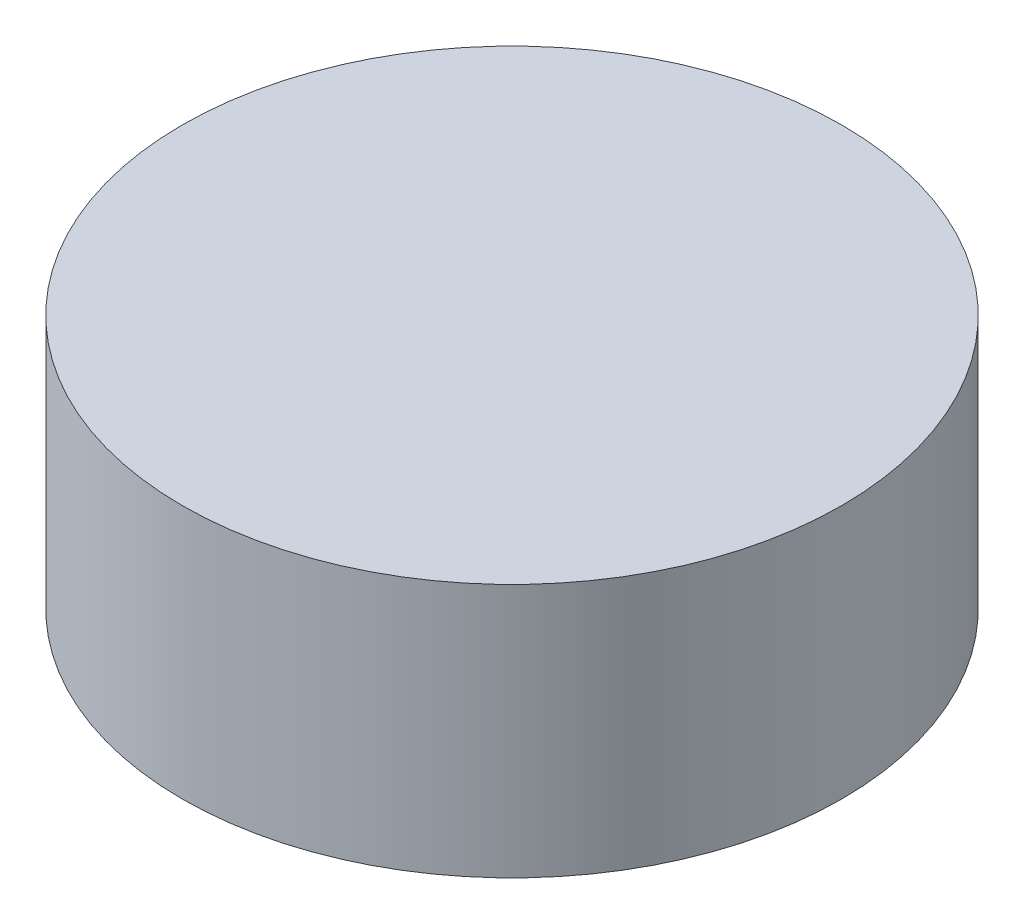
ISO-10303-21;
HEADER;
FILE_DESCRIPTION(('STEP AP214'),'2;1');
FILE_NAME('part.step','',(''),(''),'','','');
FILE_SCHEMA(('AUTOMOTIVE_DESIGN { 1 0 10303 214 1 1 1 1 }'));
ENDSEC;
DATA;
#1=APPLICATION_CONTEXT('core data for automotive mechanical design processes');
#2=APPLICATION_PROTOCOL_DEFINITION('international standard','automotive_design',2000,#1);
#3=PRODUCT_CONTEXT('',#1,'mechanical');
#4=PRODUCT('Part','Part','',(#3));
#5=PRODUCT_RELATED_PRODUCT_CATEGORY('part','',(#4));
#6=PRODUCT_DEFINITION_FORMATION('','',#4);
#7=PRODUCT_DEFINITION_CONTEXT('part definition',#1,'design');
#8=PRODUCT_DEFINITION('design','',#6,#7);
#9=PRODUCT_DEFINITION_SHAPE('','',#8);
#10=(LENGTH_UNIT() NAMED_UNIT(*) SI_UNIT(.MILLI.,.METRE.));
#11=(NAMED_UNIT(*) PLANE_ANGLE_UNIT() SI_UNIT($,.RADIAN.));
#12=(NAMED_UNIT(*) SI_UNIT($,.STERADIAN.) SOLID_ANGLE_UNIT());
#13=UNCERTAINTY_MEASURE_WITH_UNIT(LENGTH_MEASURE(1.E-05),#10,'distance_accuracy_value','');
#14=(GEOMETRIC_REPRESENTATION_CONTEXT(3) GLOBAL_UNCERTAINTY_ASSIGNED_CONTEXT((#13)) GLOBAL_UNIT_ASSIGNED_CONTEXT((#10,
#11,#12)) REPRESENTATION_CONTEXT('',''));
#15=CARTESIAN_POINT('',(0.,0.,0.));
#16=DIRECTION('',(0.,0.,1.));
#17=DIRECTION('',(1.,0.,0.));
#18=AXIS2_PLACEMENT_3D('',#15,#16,#17);
#19=CARTESIAN_POINT('',(0.,4.9911,0.));
#20=DIRECTION('',(0.,-1.,0.));
#21=DIRECTION('',(0.,0.,-1.));
#22=AXIS2_PLACEMENT_3D('',#19,#20,#21);
#23=CYLINDRICAL_SURFACE('',#22,6.475000004);
#24=CARTESIAN_POINT('',(0.,4.9911,0.));
#25=DIRECTION('',(0.,1.,0.));
#26=DIRECTION('',(0.,0.,1.));
#27=AXIS2_PLACEMENT_3D('',#24,#25,#26);
#28=CIRCLE('',#27,6.475000004);
#29=CARTESIAN_POINT('',(0.,4.9911,-6.475000004));
#30=VERTEX_POINT('',#29);
#31=EDGE_CURVE('E10',#30,#30,#28,.T.);
#32=CARTESIAN_POINT('',(0.,0.,0.));
#33=DIRECTION('',(0.,1.,0.));
#34=DIRECTION('',(0.,0.,1.));
#35=AXIS2_PLACEMENT_3D('',#32,#33,#34);
#36=CIRCLE('',#35,6.475000004);
#37=CARTESIAN_POINT('',(0.,0.,-6.475000004));
#38=VERTEX_POINT('',#37);
#39=EDGE_CURVE('E42',#38,#38,#36,.T.);
#40=CARTESIAN_POINT('',(0.,4.9911,-6.475000004));
#41=CARTESIAN_POINT('',(0.,4.939109375,-6.475000004));
#42=CARTESIAN_POINT('',(0.,4.88711875,-6.475000004));
#43=CARTESIAN_POINT('',(0.,4.7831375,-6.475000004));
#44=CARTESIAN_POINT('',(0.,4.731146875,-6.475000004));
#45=CARTESIAN_POINT('',(0.,4.627165625,-6.475000004));
#46=CARTESIAN_POINT('',(0.,4.575175,-6.475000004));
#47=CARTESIAN_POINT('',(0.,4.47119375,-6.475000004));
#48=CARTESIAN_POINT('',(0.,4.419203125,-6.475000004));
#49=CARTESIAN_POINT('',(0.,4.315221875,-6.475000004));
#50=CARTESIAN_POINT('',(0.,4.26323125,-6.475000004));
#51=CARTESIAN_POINT('',(0.,4.15925,-6.475000004));
#52=CARTESIAN_POINT('',(0.,4.107259375,-6.475000004));
#53=CARTESIAN_POINT('',(0.,4.003278125,-6.475000004));
#54=CARTESIAN_POINT('',(0.,3.9512875,-6.475000004));
#55=CARTESIAN_POINT('',(0.,3.84730625,-6.475000004));
#56=CARTESIAN_POINT('',(0.,3.795315625,-6.475000004));
#57=CARTESIAN_POINT('',(0.,3.691334375,-6.475000004));
#58=CARTESIAN_POINT('',(0.,3.63934375,-6.475000004));
#59=CARTESIAN_POINT('',(0.,3.5353625,-6.475000004));
#60=CARTESIAN_POINT('',(0.,3.483371875,-6.475000004));
#61=CARTESIAN_POINT('',(0.,3.379390625,-6.475000004));
#62=CARTESIAN_POINT('',(0.,3.3274,-6.475000004));
#63=CARTESIAN_POINT('',(0.,3.22341875,-6.475000004));
#64=CARTESIAN_POINT('',(0.,3.171428125,-6.475000004));
#65=CARTESIAN_POINT('',(0.,3.067446875,-6.475000004));
#66=CARTESIAN_POINT('',(0.,3.01545625,-6.475000004));
#67=CARTESIAN_POINT('',(0.,2.911475,-6.475000004));
#68=CARTESIAN_POINT('',(0.,2.859484375,-6.475000004));
#69=CARTESIAN_POINT('',(0.,2.755503125,-6.475000004));
#70=CARTESIAN_POINT('',(0.,2.7035125,-6.475000004));
#71=CARTESIAN_POINT('',(0.,2.59953125,-6.475000004));
#72=CARTESIAN_POINT('',(0.,2.547540625,-6.475000004));
#73=CARTESIAN_POINT('',(0.,2.443559375,-6.475000004));
#74=CARTESIAN_POINT('',(0.,2.39156875,-6.475000004));
#75=CARTESIAN_POINT('',(0.,2.2875875,-6.475000004));
#76=CARTESIAN_POINT('',(0.,2.235596875,-6.475000004));
#77=CARTESIAN_POINT('',(0.,2.131615625,-6.475000004));
#78=CARTESIAN_POINT('',(0.,2.079625,-6.475000004));
#79=CARTESIAN_POINT('',(0.,1.97564375,-6.475000004));
#80=CARTESIAN_POINT('',(0.,1.923653125,-6.475000004));
#81=CARTESIAN_POINT('',(0.,1.819671875,-6.475000004));
#82=CARTESIAN_POINT('',(0.,1.76768125,-6.475000004));
#83=CARTESIAN_POINT('',(0.,1.6637,-6.475000004));
#84=CARTESIAN_POINT('',(0.,1.611709375,-6.475000004));
#85=CARTESIAN_POINT('',(0.,1.507728125,-6.475000004));
#86=CARTESIAN_POINT('',(0.,1.4557375,-6.475000004));
#87=CARTESIAN_POINT('',(0.,1.35175625,-6.475000004));
#88=CARTESIAN_POINT('',(0.,1.299765625,-6.475000004));
#89=CARTESIAN_POINT('',(0.,1.195784375,-6.475000004));
#90=CARTESIAN_POINT('',(0.,1.14379375,-6.475000004));
#91=CARTESIAN_POINT('',(0.,1.0398125,-6.475000004));
#92=CARTESIAN_POINT('',(0.,0.987821874999999,-6.475000004));
#93=CARTESIAN_POINT('',(0.,0.883840625,-6.475000004));
#94=CARTESIAN_POINT('',(0.,0.83185,-6.475000004));
#95=CARTESIAN_POINT('',(0.,0.72786875,-6.475000004));
#96=CARTESIAN_POINT('',(0.,0.675878124999999,-6.475000004));
#97=CARTESIAN_POINT('',(0.,0.571896874999999,-6.475000004));
#98=CARTESIAN_POINT('',(0.,0.519906249999999,-6.475000004));
#99=CARTESIAN_POINT('',(0.,0.415924999999999,-6.475000004));
#100=CARTESIAN_POINT('',(0.,0.363934374999999,-6.475000004));
#101=CARTESIAN_POINT('',(0.,0.259953124999999,-6.475000004));
#102=CARTESIAN_POINT('',(0.,0.207962499999999,-6.475000004));
#103=CARTESIAN_POINT('',(0.,0.103981249999999,-6.475000004));
#104=CARTESIAN_POINT('',(0.,0.0519906249999991,-6.475000004));
#105=CARTESIAN_POINT('',(0.,0.,-6.475000004));
#106=B_SPLINE_CURVE_WITH_KNOTS('',3,(#40,#41,#42,#43,#44,#45,#46,#47,#48,#49,#50,#51,#52,#53,
#54,#55,#56,#57,#58,#59,#60,#61,#62,#63,#64,#65,#66,#67,#68,#69,#70,#71,#72,#73,#74,#75,#76,#77,
#78,#79,#80,#81,#82,#83,#84,#85,#86,#87,#88,#89,#90,#91,#92,#93,#94,#95,#96,#97,#98,#99,#100,
#101,#102,#103,#104,#105),.UNSPECIFIED.,.F.,.F.,(4,2,2,2,2,2,2,2,2,2,2,2,2,2,2,2,2,2,2,2,2,2,2,
2,2,2,2,2,2,2,2,2,4),(0.,0.155971875000001,0.311943750000001,0.467915625000001,
0.623887500000001,0.779859375000001,0.935831250000001,1.091803125,1.247775,1.403746875,
1.55971875,1.715690625,1.8716625,2.027634375,2.18360625,2.339578125,2.49555,2.651521875,
2.80749375,2.963465625,3.1194375,3.275409375,3.43138125,3.587353125,3.743325,3.899296875,
4.05526875,4.211240625,4.3672125,4.523184375,4.67915625,4.835128125,4.9911),.UNSPECIFIED.);
#107=EDGE_CURVE('BSEAM39',#30,#38,#106,.T.);
#108=ORIENTED_EDGE('',*,*,#31,.F.);
#109=ORIENTED_EDGE('',*,*,#39,.T.);
#110=ORIENTED_EDGE('',*,*,#107,.T.);
#111=ORIENTED_EDGE('',*,*,#107,.F.);
#112=EDGE_LOOP('',(#108,#110,#109,#111));
#113=FACE_BOUND('',#112,.T.);
#114=ADVANCED_FACE('F39',(#113),#23,.T.);
#115=CARTESIAN_POINT('',(0.,4.9911,0.));
#116=DIRECTION('',(0.,1.,0.));
#117=DIRECTION('',(0.,0.,1.));
#118=AXIS2_PLACEMENT_3D('',#115,#116,#117);
#119=PLANE('',#118);
#120=ORIENTED_EDGE('',*,*,#31,.T.);
#121=EDGE_LOOP('',(#120));
#122=FACE_BOUND('',#121,.T.);
#123=ADVANCED_FACE('F54',(#122),#119,.T.);
#124=CARTESIAN_POINT('',(0.,0.,0.));
#125=DIRECTION('',(0.,1.,0.));
#126=DIRECTION('',(0.,0.,1.));
#127=AXIS2_PLACEMENT_3D('',#124,#125,#126);
#128=PLANE('',#127);
#129=ORIENTED_EDGE('',*,*,#39,.F.);
#130=EDGE_LOOP('',(#129));
#131=FACE_BOUND('',#130,.T.);
#132=ADVANCED_FACE('F52',(#131),#128,.F.);
#133=CLOSED_SHELL('',(#114,#123,#132));
#134=MANIFOLD_SOLID_BREP('B2',#133);
#135=ADVANCED_BREP_SHAPE_REPRESENTATION('',(#18,#134),#14);
#136=SHAPE_DEFINITION_REPRESENTATION(#9,#135);
ENDSEC;
END-ISO-10303-21;
